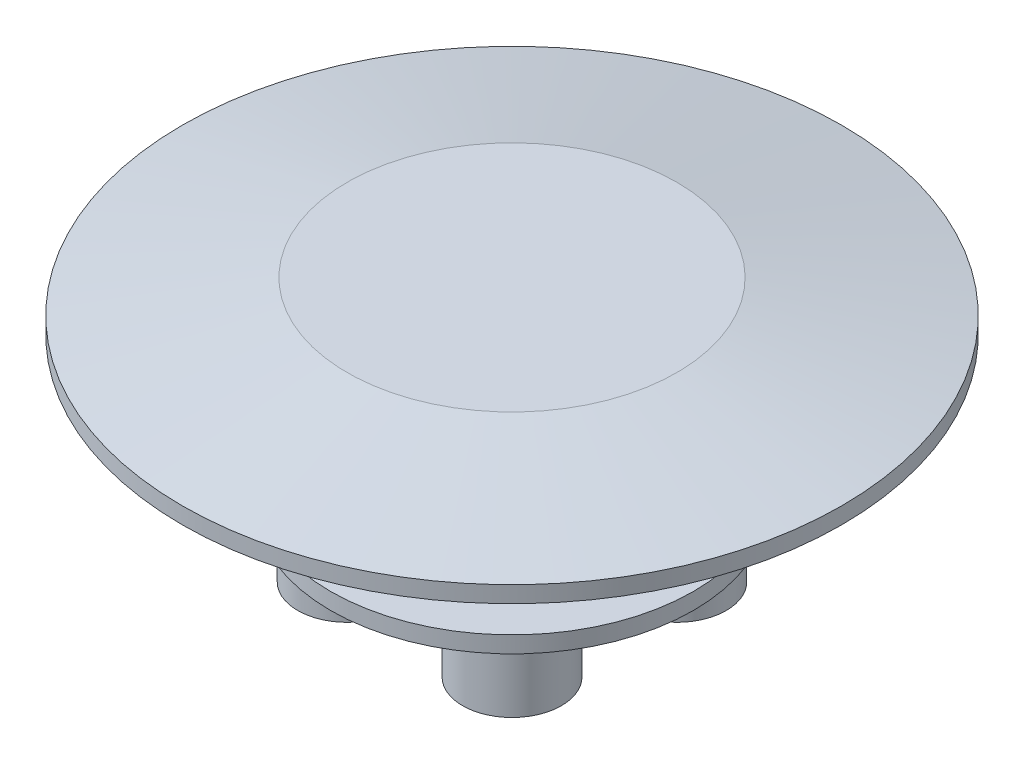
ISO-10303-21;
HEADER;
FILE_DESCRIPTION(('STEP AP214'),'2;1');
FILE_NAME('part.step','',(''),(''),'','','');
FILE_SCHEMA(('AUTOMOTIVE_DESIGN { 1 0 10303 214 1 1 1 1 }'));
ENDSEC;
DATA;
#1=APPLICATION_CONTEXT('core data for automotive mechanical design processes');
#2=APPLICATION_PROTOCOL_DEFINITION('international standard','automotive_design',2000,#1);
#3=PRODUCT_CONTEXT('',#1,'mechanical');
#4=PRODUCT('Part','Part','',(#3));
#5=PRODUCT_RELATED_PRODUCT_CATEGORY('part','',(#4));
#6=PRODUCT_DEFINITION_FORMATION('','',#4);
#7=PRODUCT_DEFINITION_CONTEXT('part definition',#1,'design');
#8=PRODUCT_DEFINITION('design','',#6,#7);
#9=PRODUCT_DEFINITION_SHAPE('','',#8);
#10=(LENGTH_UNIT() NAMED_UNIT(*) SI_UNIT(.MILLI.,.METRE.));
#11=(NAMED_UNIT(*) PLANE_ANGLE_UNIT() SI_UNIT($,.RADIAN.));
#12=(NAMED_UNIT(*) SI_UNIT($,.STERADIAN.) SOLID_ANGLE_UNIT());
#13=UNCERTAINTY_MEASURE_WITH_UNIT(LENGTH_MEASURE(1.E-05),#10,'distance_accuracy_value','');
#14=(GEOMETRIC_REPRESENTATION_CONTEXT(3) GLOBAL_UNCERTAINTY_ASSIGNED_CONTEXT((#13)) GLOBAL_UNIT_ASSIGNED_CONTEXT((#10,
#11,#12)) REPRESENTATION_CONTEXT('',''));
#15=CARTESIAN_POINT('',(0.,0.,0.));
#16=DIRECTION('',(0.,0.,1.));
#17=DIRECTION('',(1.,0.,0.));
#18=AXIS2_PLACEMENT_3D('',#15,#16,#17);
#19=CARTESIAN_POINT('',(-39.9999999999989,-32.9289321881277,-1.13441908361787E-12));
#20=DIRECTION('',(0.,-1.,0.));
#21=DIRECTION('',(0.,0.,-1.));
#22=AXIS2_PLACEMENT_3D('',#19,#20,#21);
#23=CYLINDRICAL_SURFACE('',#22,2.50000000000181);
#24=CARTESIAN_POINT('',(-39.9999999999989,-45.,-1.13441908361787E-12));
#25=DIRECTION('',(0.,-1.,0.));
#26=DIRECTION('',(0.,0.,-1.));
#27=AXIS2_PLACEMENT_3D('',#24,#25,#26);
#28=CIRCLE('',#27,2.50000000000181);
#29=CARTESIAN_POINT('',(-39.9999999999989,-45.,-2.50000000000295));
#30=VERTEX_POINT('',#29);
#31=EDGE_CURVE('E84',#30,#30,#28,.T.);
#32=ORIENTED_EDGE('',*,*,#31,.T.);
#33=EDGE_LOOP('',(#32));
#34=FACE_BOUND('',#33,.T.);
#35=CARTESIAN_POINT('',(-39.9999999999989,-41.,-1.13441908361787E-12));
#36=DIRECTION('',(0.,1.,0.));
#37=DIRECTION('',(0.,0.,1.));
#38=AXIS2_PLACEMENT_3D('',#35,#36,#37);
#39=CIRCLE('',#38,2.50000000000181);
#40=CARTESIAN_POINT('',(-39.9999999999989,-41.,2.50000000000068));
#41=VERTEX_POINT('',#40);
#42=EDGE_CURVE('E45',#41,#41,#39,.F.);
#43=ORIENTED_EDGE('',*,*,#42,.F.);
#44=EDGE_LOOP('',(#43));
#45=FACE_BOUND('',#44,.T.);
#46=ADVANCED_FACE('F41',(#34,#45),#23,.F.);
#47=CARTESIAN_POINT('',(2.25904099284255E-12,-32.9289321881277,-40.));
#48=DIRECTION('',(0.,-1.,0.));
#49=DIRECTION('',(0.,0.,-1.));
#50=AXIS2_PLACEMENT_3D('',#47,#48,#49);
#51=CYLINDRICAL_SURFACE('',#50,2.50000000000243);
#52=CARTESIAN_POINT('',(2.25904099284255E-12,-45.,-40.));
#53=DIRECTION('',(0.,-1.,0.));
#54=DIRECTION('',(0.,0.,-1.));
#55=AXIS2_PLACEMENT_3D('',#52,#53,#54);
#56=CIRCLE('',#55,2.50000000000243);
#57=CARTESIAN_POINT('',(2.25904099284255E-12,-45.,-42.5000000000024));
#58=VERTEX_POINT('',#57);
#59=EDGE_CURVE('E89',#58,#58,#56,.T.);
#60=ORIENTED_EDGE('',*,*,#59,.T.);
#61=EDGE_LOOP('',(#60));
#62=FACE_BOUND('',#61,.T.);
#63=CARTESIAN_POINT('',(2.25904099284255E-12,-41.,-40.));
#64=DIRECTION('',(0.,1.,0.));
#65=DIRECTION('',(0.,0.,1.));
#66=AXIS2_PLACEMENT_3D('',#63,#64,#65);
#67=CIRCLE('',#66,2.50000000000243);
#68=CARTESIAN_POINT('',(2.25904099284255E-12,-41.,-37.4999999999976));
#69=VERTEX_POINT('',#68);
#70=EDGE_CURVE('E77',#69,#69,#67,.F.);
#71=ORIENTED_EDGE('',*,*,#70,.F.);
#72=EDGE_LOOP('',(#71));
#73=FACE_BOUND('',#72,.T.);
#74=ADVANCED_FACE('F161',(#62,#73),#51,.F.);
#75=CARTESIAN_POINT('',(40.0000000000011,-32.9289321881277,1.12952049642128E-12));
#76=DIRECTION('',(0.,-1.,0.));
#77=DIRECTION('',(0.,0.,-1.));
#78=AXIS2_PLACEMENT_3D('',#75,#76,#77);
#79=CYLINDRICAL_SURFACE('',#78,2.50000000000088);
#80=CARTESIAN_POINT('',(40.0000000000011,-45.,1.12952049642128E-12));
#81=DIRECTION('',(0.,-1.,0.));
#82=DIRECTION('',(0.,0.,-1.));
#83=AXIS2_PLACEMENT_3D('',#80,#81,#82);
#84=CIRCLE('',#83,2.50000000000088);
#85=CARTESIAN_POINT('',(40.0000000000011,-45.,-2.49999999999975));
#86=VERTEX_POINT('',#85);
#87=EDGE_CURVE('E95',#86,#86,#84,.T.);
#88=ORIENTED_EDGE('',*,*,#87,.T.);
#89=EDGE_LOOP('',(#88));
#90=FACE_BOUND('',#89,.T.);
#91=CARTESIAN_POINT('',(40.0000000000011,-41.,1.12952049642128E-12));
#92=DIRECTION('',(0.,1.,0.));
#93=DIRECTION('',(0.,0.,1.));
#94=AXIS2_PLACEMENT_3D('',#91,#92,#93);
#95=CIRCLE('',#94,2.50000000000088);
#96=CARTESIAN_POINT('',(40.0000000000011,-41.,2.50000000000201));
#97=VERTEX_POINT('',#96);
#98=EDGE_CURVE('E73',#97,#97,#95,.F.);
#99=ORIENTED_EDGE('',*,*,#98,.F.);
#100=EDGE_LOOP('',(#99));
#101=FACE_BOUND('',#100,.T.);
#102=ADVANCED_FACE('F166',(#90,#101),#79,.F.);
#103=CARTESIAN_POINT('',(0.,-32.9289321881277,40.));
#104=DIRECTION('',(0.,-1.,0.));
#105=DIRECTION('',(0.,0.,-1.));
#106=AXIS2_PLACEMENT_3D('',#103,#104,#105);
#107=CYLINDRICAL_SURFACE('',#106,2.5);
#108=CARTESIAN_POINT('',(0.,-45.,40.));
#109=DIRECTION('',(0.,-1.,0.));
#110=DIRECTION('',(0.,0.,-1.));
#111=AXIS2_PLACEMENT_3D('',#108,#109,#110);
#112=CIRCLE('',#111,2.5);
#113=CARTESIAN_POINT('',(0.,-45.,37.5));
#114=VERTEX_POINT('',#113);
#115=EDGE_CURVE('E108',#114,#114,#112,.T.);
#116=ORIENTED_EDGE('',*,*,#115,.T.);
#117=EDGE_LOOP('',(#116));
#118=FACE_BOUND('',#117,.T.);
#119=CARTESIAN_POINT('',(0.,-41.,40.));
#120=DIRECTION('',(0.,1.,0.));
#121=DIRECTION('',(0.,0.,1.));
#122=AXIS2_PLACEMENT_3D('',#119,#120,#121);
#123=CIRCLE('',#122,2.5);
#124=CARTESIAN_POINT('',(0.,-41.,42.5));
#125=VERTEX_POINT('',#124);
#126=EDGE_CURVE('E69',#125,#125,#123,.F.);
#127=ORIENTED_EDGE('',*,*,#126,.F.);
#128=EDGE_LOOP('',(#127));
#129=FACE_BOUND('',#128,.T.);
#130=ADVANCED_FACE('F229',(#118,#129),#107,.F.);
#131=CARTESIAN_POINT('',(0.,5.,0.));
#132=DIRECTION('',(0.,-1.,0.));
#133=DIRECTION('',(0.,0.,-1.));
#134=AXIS2_PLACEMENT_3D('',#131,#132,#133);
#135=CYLINDRICAL_SURFACE('',#134,100.);
#136=CARTESIAN_POINT('',(0.,5.,0.));
#137=DIRECTION('',(0.,1.,0.));
#138=DIRECTION('',(0.,0.,1.));
#139=AXIS2_PLACEMENT_3D('',#136,#137,#138);
#140=CIRCLE('',#139,100.);
#141=CARTESIAN_POINT('',(0.,5.,100.));
#142=VERTEX_POINT('',#141);
#143=EDGE_CURVE('E50',#142,#142,#140,.T.);
#144=ORIENTED_EDGE('',*,*,#143,.F.);
#145=EDGE_LOOP('',(#144));
#146=FACE_BOUND('',#145,.T.);
#147=CARTESIAN_POINT('',(0.,0.,0.));
#148=DIRECTION('',(0.,1.,0.));
#149=DIRECTION('',(0.,0.,1.));
#150=AXIS2_PLACEMENT_3D('',#147,#148,#149);
#151=CIRCLE('',#150,100.);
#152=CARTESIAN_POINT('',(0.,0.,100.));
#153=VERTEX_POINT('',#152);
#154=EDGE_CURVE('E56',#153,#153,#151,.T.);
#155=ORIENTED_EDGE('',*,*,#154,.T.);
#156=EDGE_LOOP('',(#155));
#157=FACE_BOUND('',#156,.T.);
#158=ADVANCED_FACE('F43',(#146,#157),#135,.T.);
#159=CARTESIAN_POINT('',(0.,0.,0.));
#160=DIRECTION('',(0.,1.,0.));
#161=DIRECTION('',(0.,0.,1.));
#162=AXIS2_PLACEMENT_3D('',#159,#160,#161);
#163=PLANE('',#162);
#164=CARTESIAN_POINT('',(0.,0.,0.));
#165=DIRECTION('',(0.,-1.,0.));
#166=DIRECTION('',(0.,0.,-1.));
#167=AXIS2_PLACEMENT_3D('',#164,#165,#166);
#168=CIRCLE('',#167,22.5);
#169=CARTESIAN_POINT('',(0.,0.,-22.5));
#170=VERTEX_POINT('',#169);
#171=EDGE_CURVE('E10',#170,#170,#168,.T.);
#172=ORIENTED_EDGE('',*,*,#171,.F.);
#173=EDGE_LOOP('',(#172));
#174=FACE_BOUND('',#173,.T.);
#175=ORIENTED_EDGE('',*,*,#154,.F.);
#176=EDGE_LOOP('',(#175));
#177=FACE_BOUND('',#176,.T.);
#178=ADVANCED_FACE('F220',(#174,#177),#163,.F.);
#179=CARTESIAN_POINT('',(0.,5.,0.));
#180=DIRECTION('',(0.,-1.,0.));
#181=DIRECTION('',(0.,0.,-1.));
#182=AXIS2_PLACEMENT_3D('',#179,#180,#181);
#183=CONICAL_SURFACE('',#182,100.,1.37340076694502);
#184=CARTESIAN_POINT('',(0.,15.,0.));
#185=DIRECTION('',(0.,-1.,0.));
#186=DIRECTION('',(0.,0.,-1.));
#187=AXIS2_PLACEMENT_3D('',#184,#185,#186);
#188=CIRCLE('',#187,50.);
#189=CARTESIAN_POINT('',(0.,15.,-50.));
#190=VERTEX_POINT('',#189);
#191=EDGE_CURVE('E62',#190,#190,#188,.T.);
#192=ORIENTED_EDGE('',*,*,#191,.T.);
#193=EDGE_LOOP('',(#192));
#194=FACE_BOUND('',#193,.T.);
#195=ORIENTED_EDGE('',*,*,#143,.T.);
#196=EDGE_LOOP('',(#195));
#197=FACE_BOUND('',#196,.T.);
#198=ADVANCED_FACE('F217',(#194,#197),#183,.T.);
#199=CARTESIAN_POINT('',(0.,15.,0.));
#200=DIRECTION('',(0.,-1.,0.));
#201=DIRECTION('',(0.,0.,-1.));
#202=AXIS2_PLACEMENT_3D('',#199,#200,#201);
#203=PLANE('',#202);
#204=ORIENTED_EDGE('',*,*,#191,.F.);
#205=EDGE_LOOP('',(#204));
#206=FACE_BOUND('',#205,.T.);
#207=ADVANCED_FACE('F213',(#206),#203,.F.);
#208=CARTESIAN_POINT('',(0.,-40.,0.));
#209=DIRECTION('',(0.,1.,0.));
#210=DIRECTION('',(0.,0.,1.));
#211=AXIS2_PLACEMENT_3D('',#208,#209,#210);
#212=CYLINDRICAL_SURFACE('',#211,22.5);
#213=CARTESIAN_POINT('',(0.,-40.,0.));
#214=DIRECTION('',(0.,-1.,0.));
#215=DIRECTION('',(0.,0.,-1.));
#216=AXIS2_PLACEMENT_3D('',#213,#214,#215);
#217=CIRCLE('',#216,22.5);
#218=CARTESIAN_POINT('',(0.,-40.,-22.5));
#219=VERTEX_POINT('',#218);
#220=EDGE_CURVE('E60',#219,#219,#217,.T.);
#221=ORIENTED_EDGE('',*,*,#220,.F.);
#222=EDGE_LOOP('',(#221));
#223=FACE_BOUND('',#222,.T.);
#224=ORIENTED_EDGE('',*,*,#171,.T.);
#225=EDGE_LOOP('',(#224));
#226=FACE_BOUND('',#225,.T.);
#227=ADVANCED_FACE('F209',(#223,#226),#212,.T.);
#228=CARTESIAN_POINT('',(0.,-45.,0.));
#229=DIRECTION('',(0.,1.,0.));
#230=DIRECTION('',(0.,0.,1.));
#231=AXIS2_PLACEMENT_3D('',#228,#229,#230);
#232=CYLINDRICAL_SURFACE('',#231,55.);
#233=CARTESIAN_POINT('',(0.,-45.,0.));
#234=DIRECTION('',(0.,-1.,0.));
#235=DIRECTION('',(0.,0.,-1.));
#236=AXIS2_PLACEMENT_3D('',#233,#234,#235);
#237=CIRCLE('',#236,55.);
#238=CARTESIAN_POINT('',(0.,-45.,-55.));
#239=VERTEX_POINT('',#238);
#240=EDGE_CURVE('E133',#239,#239,#237,.T.);
#241=ORIENTED_EDGE('',*,*,#240,.F.);
#242=EDGE_LOOP('',(#241));
#243=FACE_BOUND('',#242,.T.);
#244=CARTESIAN_POINT('',(0.,-40.,0.));
#245=DIRECTION('',(0.,-1.,0.));
#246=DIRECTION('',(0.,0.,-1.));
#247=AXIS2_PLACEMENT_3D('',#244,#245,#246);
#248=CIRCLE('',#247,55.);
#249=CARTESIAN_POINT('',(0.,-40.,-55.));
#250=VERTEX_POINT('',#249);
#251=EDGE_CURVE('E129',#250,#250,#248,.T.);
#252=ORIENTED_EDGE('',*,*,#251,.T.);
#253=EDGE_LOOP('',(#252));
#254=FACE_BOUND('',#253,.T.);
#255=ADVANCED_FACE('F140',(#243,#254),#232,.T.);
#256=CARTESIAN_POINT('',(0.,-45.,0.));
#257=DIRECTION('',(0.,-1.,0.));
#258=DIRECTION('',(0.,0.,-1.));
#259=AXIS2_PLACEMENT_3D('',#256,#257,#258);
#260=PLANE('',#259);
#261=ORIENTED_EDGE('',*,*,#115,.F.);
#262=EDGE_LOOP('',(#261));
#263=FACE_BOUND('',#262,.T.);
#264=ORIENTED_EDGE('',*,*,#87,.F.);
#265=EDGE_LOOP('',(#264));
#266=FACE_BOUND('',#265,.T.);
#267=ORIENTED_EDGE('',*,*,#59,.F.);
#268=EDGE_LOOP('',(#267));
#269=FACE_BOUND('',#268,.T.);
#270=ORIENTED_EDGE('',*,*,#31,.F.);
#271=EDGE_LOOP('',(#270));
#272=FACE_BOUND('',#271,.T.);
#273=CARTESIAN_POINT('',(-25.0000000000001,-45.,-24.9999999999999));
#274=DIRECTION('',(0.,-1.,0.));
#275=DIRECTION('',(0.,0.,-1.));
#276=AXIS2_PLACEMENT_3D('',#273,#274,#275);
#277=CIRCLE('',#276,15.);
#278=CARTESIAN_POINT('',(-25.0000000000001,-45.,-39.9999999999999));
#279=VERTEX_POINT('',#278);
#280=EDGE_CURVE('E99',#279,#279,#277,.T.);
#281=ORIENTED_EDGE('',*,*,#280,.F.);
#282=EDGE_LOOP('',(#281));
#283=FACE_BOUND('',#282,.T.);
#284=CARTESIAN_POINT('',(-25.0000000000001,-45.,25.0000000000001));
#285=DIRECTION('',(0.,-1.,0.));
#286=DIRECTION('',(0.,0.,-1.));
#287=AXIS2_PLACEMENT_3D('',#284,#285,#286);
#288=CIRCLE('',#287,15.);
#289=CARTESIAN_POINT('',(-25.0000000000001,-45.,10.0000000000001));
#290=VERTEX_POINT('',#289);
#291=EDGE_CURVE('E109',#290,#290,#288,.T.);
#292=ORIENTED_EDGE('',*,*,#291,.F.);
#293=EDGE_LOOP('',(#292));
#294=FACE_BOUND('',#293,.T.);
#295=CARTESIAN_POINT('',(24.9999999999999,-45.,25.0000000000001));
#296=DIRECTION('',(0.,-1.,0.));
#297=DIRECTION('',(0.,0.,-1.));
#298=AXIS2_PLACEMENT_3D('',#295,#296,#297);
#299=CIRCLE('',#298,15.);
#300=CARTESIAN_POINT('',(24.9999999999999,-45.,10.0000000000001));
#301=VERTEX_POINT('',#300);
#302=EDGE_CURVE('E117',#301,#301,#299,.T.);
#303=ORIENTED_EDGE('',*,*,#302,.F.);
#304=EDGE_LOOP('',(#303));
#305=FACE_BOUND('',#304,.T.);
#306=CARTESIAN_POINT('',(24.9999999999999,-45.,-24.9999999999999));
#307=DIRECTION('',(0.,-1.,0.));
#308=DIRECTION('',(0.,0.,-1.));
#309=AXIS2_PLACEMENT_3D('',#306,#307,#308);
#310=CIRCLE('',#309,15.);
#311=CARTESIAN_POINT('',(24.9999999999999,-45.,-39.9999999999999));
#312=VERTEX_POINT('',#311);
#313=EDGE_CURVE('E121',#312,#312,#310,.T.);
#314=ORIENTED_EDGE('',*,*,#313,.F.);
#315=EDGE_LOOP('',(#314));
#316=FACE_BOUND('',#315,.T.);
#317=ORIENTED_EDGE('',*,*,#240,.T.);
#318=EDGE_LOOP('',(#317));
#319=FACE_BOUND('',#318,.T.);
#320=ADVANCED_FACE('F145',(#263,#266,#269,#272,#283,#294,#305,#316,#319),#260,.T.);
#321=CARTESIAN_POINT('',(0.,-40.,0.));
#322=DIRECTION('',(0.,-1.,0.));
#323=DIRECTION('',(0.,0.,-1.));
#324=AXIS2_PLACEMENT_3D('',#321,#322,#323);
#325=PLANE('',#324);
#326=CARTESIAN_POINT('',(2.25904099284255E-12,-40.,-40.));
#327=DIRECTION('',(0.,1.,0.));
#328=DIRECTION('',(0.,0.,1.));
#329=AXIS2_PLACEMENT_3D('',#326,#327,#328);
#330=CIRCLE('',#329,10.);
#331=CARTESIAN_POINT('',(2.25904099284255E-12,-40.,-30.));
#332=VERTEX_POINT('',#331);
#333=EDGE_CURVE('E283',#332,#332,#330,.T.);
#334=ORIENTED_EDGE('',*,*,#333,.F.);
#335=EDGE_LOOP('',(#334));
#336=FACE_BOUND('',#335,.T.);
#337=CARTESIAN_POINT('',(40.0000000000011,-40.,1.14421625801104E-12));
#338=DIRECTION('',(0.,1.,0.));
#339=DIRECTION('',(0.,0.,1.));
#340=AXIS2_PLACEMENT_3D('',#337,#338,#339);
#341=CIRCLE('',#340,10.0000000000009);
#342=CARTESIAN_POINT('',(40.0000000000011,-40.,10.000000000002));
#343=VERTEX_POINT('',#342);
#344=EDGE_CURVE('E287',#343,#343,#341,.T.);
#345=ORIENTED_EDGE('',*,*,#344,.F.);
#346=EDGE_LOOP('',(#345));
#347=FACE_BOUND('',#346,.T.);
#348=CARTESIAN_POINT('',(0.,-40.,40.));
#349=DIRECTION('',(0.,1.,0.));
#350=DIRECTION('',(0.,0.,1.));
#351=AXIS2_PLACEMENT_3D('',#348,#349,#350);
#352=CIRCLE('',#351,10.0000000000024);
#353=CARTESIAN_POINT('',(0.,-40.,50.0000000000024));
#354=VERTEX_POINT('',#353);
#355=EDGE_CURVE('E297',#354,#354,#352,.T.);
#356=ORIENTED_EDGE('',*,*,#355,.F.);
#357=EDGE_LOOP('',(#356));
#358=FACE_BOUND('',#357,.T.);
#359=CARTESIAN_POINT('',(-39.9999999999989,-40.,-1.13931767081446E-12));
#360=DIRECTION('',(0.,1.,0.));
#361=DIRECTION('',(0.,0.,1.));
#362=AXIS2_PLACEMENT_3D('',#359,#360,#361);
#363=CIRCLE('',#362,10.0000000000018);
#364=CARTESIAN_POINT('',(-39.9999999999989,-40.,10.0000000000007));
#365=VERTEX_POINT('',#364);
#366=EDGE_CURVE('E305',#365,#365,#363,.T.);
#367=ORIENTED_EDGE('',*,*,#366,.F.);
#368=EDGE_LOOP('',(#367));
#369=FACE_BOUND('',#368,.T.);
#370=ORIENTED_EDGE('',*,*,#220,.T.);
#371=EDGE_LOOP('',(#370));
#372=FACE_BOUND('',#371,.T.);
#373=ORIENTED_EDGE('',*,*,#251,.F.);
#374=EDGE_LOOP('',(#373));
#375=FACE_BOUND('',#374,.T.);
#376=ADVANCED_FACE('F142',(#336,#347,#358,#369,#372,#375),#325,.F.);
#377=CARTESIAN_POINT('',(24.9999999999999,-65.,-24.9999999999999));
#378=DIRECTION('',(0.,1.,0.));
#379=DIRECTION('',(0.,0.,1.));
#380=AXIS2_PLACEMENT_3D('',#377,#378,#379);
#381=CYLINDRICAL_SURFACE('',#380,15.);
#382=CARTESIAN_POINT('',(24.9999999999999,-65.,-24.9999999999999));
#383=DIRECTION('',(0.,-1.,0.));
#384=DIRECTION('',(0.,0.,-1.));
#385=AXIS2_PLACEMENT_3D('',#382,#383,#384);
#386=CIRCLE('',#385,15.);
#387=CARTESIAN_POINT('',(24.9999999999999,-65.,-39.9999999999999));
#388=VERTEX_POINT('',#387);
#389=EDGE_CURVE('E125',#388,#388,#386,.T.);
#390=ORIENTED_EDGE('',*,*,#389,.F.);
#391=EDGE_LOOP('',(#390));
#392=FACE_BOUND('',#391,.T.);
#393=ORIENTED_EDGE('',*,*,#313,.T.);
#394=EDGE_LOOP('',(#393));
#395=FACE_BOUND('',#394,.T.);
#396=ADVANCED_FACE('F144',(#392,#395),#381,.T.);
#397=CARTESIAN_POINT('',(24.9999999999999,-65.,-24.9999999999999));
#398=DIRECTION('',(0.,-1.,0.));
#399=DIRECTION('',(0.,0.,-1.));
#400=AXIS2_PLACEMENT_3D('',#397,#398,#399);
#401=PLANE('',#400);
#402=ORIENTED_EDGE('',*,*,#389,.T.);
#403=EDGE_LOOP('',(#402));
#404=FACE_BOUND('',#403,.T.);
#405=ADVANCED_FACE('F152',(#404),#401,.T.);
#406=CARTESIAN_POINT('',(24.9999999999999,-65.,25.0000000000001));
#407=DIRECTION('',(0.,1.,0.));
#408=DIRECTION('',(0.,0.,1.));
#409=AXIS2_PLACEMENT_3D('',#406,#407,#408);
#410=CYLINDRICAL_SURFACE('',#409,15.);
#411=CARTESIAN_POINT('',(24.9999999999999,-65.,25.0000000000001));
#412=DIRECTION('',(0.,-1.,0.));
#413=DIRECTION('',(0.,0.,-1.));
#414=AXIS2_PLACEMENT_3D('',#411,#412,#413);
#415=CIRCLE('',#414,15.);
#416=CARTESIAN_POINT('',(24.9999999999999,-65.,10.0000000000001));
#417=VERTEX_POINT('',#416);
#418=EDGE_CURVE('E113',#417,#417,#415,.T.);
#419=ORIENTED_EDGE('',*,*,#418,.F.);
#420=EDGE_LOOP('',(#419));
#421=FACE_BOUND('',#420,.T.);
#422=ORIENTED_EDGE('',*,*,#302,.T.);
#423=EDGE_LOOP('',(#422));
#424=FACE_BOUND('',#423,.T.);
#425=ADVANCED_FACE('F190',(#421,#424),#410,.T.);
#426=CARTESIAN_POINT('',(24.9999999999999,-65.,25.0000000000001));
#427=DIRECTION('',(0.,-1.,0.));
#428=DIRECTION('',(0.,0.,-1.));
#429=AXIS2_PLACEMENT_3D('',#426,#427,#428);
#430=PLANE('',#429);
#431=ORIENTED_EDGE('',*,*,#418,.T.);
#432=EDGE_LOOP('',(#431));
#433=FACE_BOUND('',#432,.T.);
#434=ADVANCED_FACE('F185',(#433),#430,.T.);
#435=CARTESIAN_POINT('',(-25.0000000000001,-65.,25.0000000000001));
#436=DIRECTION('',(0.,1.,0.));
#437=DIRECTION('',(0.,0.,1.));
#438=AXIS2_PLACEMENT_3D('',#435,#436,#437);
#439=CYLINDRICAL_SURFACE('',#438,15.);
#440=CARTESIAN_POINT('',(-25.0000000000001,-65.,25.0000000000001));
#441=DIRECTION('',(0.,-1.,0.));
#442=DIRECTION('',(0.,0.,-1.));
#443=AXIS2_PLACEMENT_3D('',#440,#441,#442);
#444=CIRCLE('',#443,15.);
#445=CARTESIAN_POINT('',(-25.0000000000001,-65.,10.0000000000001));
#446=VERTEX_POINT('',#445);
#447=EDGE_CURVE('E103',#446,#446,#444,.T.);
#448=ORIENTED_EDGE('',*,*,#447,.F.);
#449=EDGE_LOOP('',(#448));
#450=FACE_BOUND('',#449,.T.);
#451=ORIENTED_EDGE('',*,*,#291,.T.);
#452=EDGE_LOOP('',(#451));
#453=FACE_BOUND('',#452,.T.);
#454=ADVANCED_FACE('F182',(#450,#453),#439,.T.);
#455=CARTESIAN_POINT('',(-25.0000000000001,-65.,25.0000000000001));
#456=DIRECTION('',(0.,-1.,0.));
#457=DIRECTION('',(0.,0.,-1.));
#458=AXIS2_PLACEMENT_3D('',#455,#456,#457);
#459=PLANE('',#458);
#460=ORIENTED_EDGE('',*,*,#447,.T.);
#461=EDGE_LOOP('',(#460));
#462=FACE_BOUND('',#461,.T.);
#463=ADVANCED_FACE('F176',(#462),#459,.T.);
#464=CARTESIAN_POINT('',(-25.0000000000001,-65.,-24.9999999999999));
#465=DIRECTION('',(0.,1.,0.));
#466=DIRECTION('',(0.,0.,1.));
#467=AXIS2_PLACEMENT_3D('',#464,#465,#466);
#468=CYLINDRICAL_SURFACE('',#467,15.);
#469=CARTESIAN_POINT('',(-25.0000000000001,-65.,-24.9999999999999));
#470=DIRECTION('',(0.,-1.,0.));
#471=DIRECTION('',(0.,0.,-1.));
#472=AXIS2_PLACEMENT_3D('',#469,#470,#471);
#473=CIRCLE('',#472,15.);
#474=CARTESIAN_POINT('',(-25.0000000000001,-65.,-39.9999999999999));
#475=VERTEX_POINT('',#474);
#476=EDGE_CURVE('E104',#475,#475,#473,.T.);
#477=ORIENTED_EDGE('',*,*,#476,.F.);
#478=EDGE_LOOP('',(#477));
#479=FACE_BOUND('',#478,.T.);
#480=ORIENTED_EDGE('',*,*,#280,.T.);
#481=EDGE_LOOP('',(#480));
#482=FACE_BOUND('',#481,.T.);
#483=ADVANCED_FACE('F172',(#479,#482),#468,.T.);
#484=CARTESIAN_POINT('',(-25.0000000000001,-65.,-24.9999999999999));
#485=DIRECTION('',(0.,-1.,0.));
#486=DIRECTION('',(0.,0.,-1.));
#487=AXIS2_PLACEMENT_3D('',#484,#485,#486);
#488=PLANE('',#487);
#489=ORIENTED_EDGE('',*,*,#476,.T.);
#490=EDGE_LOOP('',(#489));
#491=FACE_BOUND('',#490,.T.);
#492=ADVANCED_FACE('F175',(#491),#488,.T.);
#493=CARTESIAN_POINT('',(0.,-41.,40.));
#494=DIRECTION('',(0.,1.,0.));
#495=DIRECTION('',(0.,0.,1.));
#496=AXIS2_PLACEMENT_3D('',#493,#494,#495);
#497=PLANE('',#496);
#498=CARTESIAN_POINT('',(0.,-41.,40.));
#499=DIRECTION('',(0.,1.,0.));
#500=DIRECTION('',(0.,0.,1.));
#501=AXIS2_PLACEMENT_3D('',#498,#499,#500);
#502=CIRCLE('',#501,10.0000000000024);
#503=CARTESIAN_POINT('',(0.,-41.,50.0000000000024));
#504=VERTEX_POINT('',#503);
#505=EDGE_CURVE('E301',#504,#504,#502,.T.);
#506=ORIENTED_EDGE('',*,*,#505,.T.);
#507=EDGE_LOOP('',(#506));
#508=FACE_BOUND('',#507,.T.);
#509=ORIENTED_EDGE('',*,*,#126,.T.);
#510=EDGE_LOOP('',(#509));
#511=FACE_BOUND('',#510,.T.);
#512=ADVANCED_FACE('F180',(#508,#511),#497,.T.);
#513=CARTESIAN_POINT('',(0.,-41.,40.));
#514=DIRECTION('',(0.,1.,0.));
#515=DIRECTION('',(0.,0.,1.));
#516=AXIS2_PLACEMENT_3D('',#513,#514,#515);
#517=CYLINDRICAL_SURFACE('',#516,10.0000000000024);
#518=ORIENTED_EDGE('',*,*,#505,.F.);
#519=EDGE_LOOP('',(#518));
#520=FACE_BOUND('',#519,.T.);
#521=ORIENTED_EDGE('',*,*,#355,.T.);
#522=EDGE_LOOP('',(#521));
#523=FACE_BOUND('',#522,.T.);
#524=ADVANCED_FACE('F259',(#520,#523),#517,.F.);
#525=CARTESIAN_POINT('',(40.0000000000011,-41.,1.14421625801104E-12));
#526=DIRECTION('',(0.,1.,0.));
#527=DIRECTION('',(0.,0.,1.));
#528=AXIS2_PLACEMENT_3D('',#525,#526,#527);
#529=PLANE('',#528);
#530=CARTESIAN_POINT('',(40.0000000000011,-41.,1.14421625801104E-12));
#531=DIRECTION('',(0.,1.,0.));
#532=DIRECTION('',(0.,0.,1.));
#533=AXIS2_PLACEMENT_3D('',#530,#531,#532);
#534=CIRCLE('',#533,10.0000000000009);
#535=CARTESIAN_POINT('',(40.0000000000011,-41.,10.000000000002));
#536=VERTEX_POINT('',#535);
#537=EDGE_CURVE('E293',#536,#536,#534,.T.);
#538=ORIENTED_EDGE('',*,*,#537,.T.);
#539=EDGE_LOOP('',(#538));
#540=FACE_BOUND('',#539,.T.);
#541=ORIENTED_EDGE('',*,*,#98,.T.);
#542=EDGE_LOOP('',(#541));
#543=FACE_BOUND('',#542,.T.);
#544=ADVANCED_FACE('F263',(#540,#543),#529,.T.);
#545=CARTESIAN_POINT('',(40.0000000000011,-41.,1.14421625801104E-12));
#546=DIRECTION('',(0.,1.,0.));
#547=DIRECTION('',(0.,0.,1.));
#548=AXIS2_PLACEMENT_3D('',#545,#546,#547);
#549=CYLINDRICAL_SURFACE('',#548,10.0000000000009);
#550=ORIENTED_EDGE('',*,*,#537,.F.);
#551=EDGE_LOOP('',(#550));
#552=FACE_BOUND('',#551,.T.);
#553=ORIENTED_EDGE('',*,*,#344,.T.);
#554=EDGE_LOOP('',(#553));
#555=FACE_BOUND('',#554,.T.);
#556=ADVANCED_FACE('F267',(#552,#555),#549,.F.);
#557=CARTESIAN_POINT('',(2.25904099284255E-12,-41.,-40.));
#558=DIRECTION('',(0.,1.,0.));
#559=DIRECTION('',(0.,0.,1.));
#560=AXIS2_PLACEMENT_3D('',#557,#558,#559);
#561=PLANE('',#560);
#562=CARTESIAN_POINT('',(2.25904099284255E-12,-41.,-40.));
#563=DIRECTION('',(0.,1.,0.));
#564=DIRECTION('',(0.,0.,1.));
#565=AXIS2_PLACEMENT_3D('',#562,#563,#564);
#566=CIRCLE('',#565,10.);
#567=CARTESIAN_POINT('',(2.25904099284255E-12,-41.,-30.));
#568=VERTEX_POINT('',#567);
#569=EDGE_CURVE('E74',#568,#568,#566,.T.);
#570=ORIENTED_EDGE('',*,*,#569,.T.);
#571=EDGE_LOOP('',(#570));
#572=FACE_BOUND('',#571,.T.);
#573=ORIENTED_EDGE('',*,*,#70,.T.);
#574=EDGE_LOOP('',(#573));
#575=FACE_BOUND('',#574,.T.);
#576=ADVANCED_FACE('F271',(#572,#575),#561,.T.);
#577=CARTESIAN_POINT('',(2.25904099284255E-12,-41.,-40.));
#578=DIRECTION('',(0.,1.,0.));
#579=DIRECTION('',(0.,0.,1.));
#580=AXIS2_PLACEMENT_3D('',#577,#578,#579);
#581=CYLINDRICAL_SURFACE('',#580,10.);
#582=ORIENTED_EDGE('',*,*,#569,.F.);
#583=EDGE_LOOP('',(#582));
#584=FACE_BOUND('',#583,.T.);
#585=ORIENTED_EDGE('',*,*,#333,.T.);
#586=EDGE_LOOP('',(#585));
#587=FACE_BOUND('',#586,.T.);
#588=ADVANCED_FACE('F252',(#584,#587),#581,.F.);
#589=CARTESIAN_POINT('',(-39.9999999999989,-41.,-1.13931767081446E-12));
#590=DIRECTION('',(0.,1.,0.));
#591=DIRECTION('',(0.,0.,1.));
#592=AXIS2_PLACEMENT_3D('',#589,#590,#591);
#593=PLANE('',#592);
#594=CARTESIAN_POINT('',(-39.9999999999989,-41.,-1.13931767081446E-12));
#595=DIRECTION('',(0.,1.,0.));
#596=DIRECTION('',(0.,0.,1.));
#597=AXIS2_PLACEMENT_3D('',#594,#595,#596);
#598=CIRCLE('',#597,10.0000000000018);
#599=CARTESIAN_POINT('',(-39.9999999999989,-41.,10.0000000000007));
#600=VERTEX_POINT('',#599);
#601=EDGE_CURVE('E309',#600,#600,#598,.T.);
#602=ORIENTED_EDGE('',*,*,#601,.T.);
#603=EDGE_LOOP('',(#602));
#604=FACE_BOUND('',#603,.T.);
#605=ORIENTED_EDGE('',*,*,#42,.T.);
#606=EDGE_LOOP('',(#605));
#607=FACE_BOUND('',#606,.T.);
#608=ADVANCED_FACE('F248',(#604,#607),#593,.T.);
#609=CARTESIAN_POINT('',(-39.9999999999989,-41.,-1.13931767081446E-12));
#610=DIRECTION('',(0.,1.,0.));
#611=DIRECTION('',(0.,0.,1.));
#612=AXIS2_PLACEMENT_3D('',#609,#610,#611);
#613=CYLINDRICAL_SURFACE('',#612,10.0000000000018);
#614=ORIENTED_EDGE('',*,*,#601,.F.);
#615=EDGE_LOOP('',(#614));
#616=FACE_BOUND('',#615,.T.);
#617=ORIENTED_EDGE('',*,*,#366,.T.);
#618=EDGE_LOOP('',(#617));
#619=FACE_BOUND('',#618,.T.);
#620=ADVANCED_FACE('F251',(#616,#619),#613,.F.);
#621=CLOSED_SHELL('',(#46,#74,#102,#130,#158,#178,#198,#207,#227,#255,#320,#376,#396,#405,#425,
#434,#454,#463,#483,#492,#512,#524,#544,#556,#576,#588,#608,#620));
#622=MANIFOLD_SOLID_BREP('B2',#621);
#623=ADVANCED_BREP_SHAPE_REPRESENTATION('',(#18,#622),#14);
#624=SHAPE_DEFINITION_REPRESENTATION(#9,#623);
ENDSEC;
END-ISO-10303-21;
